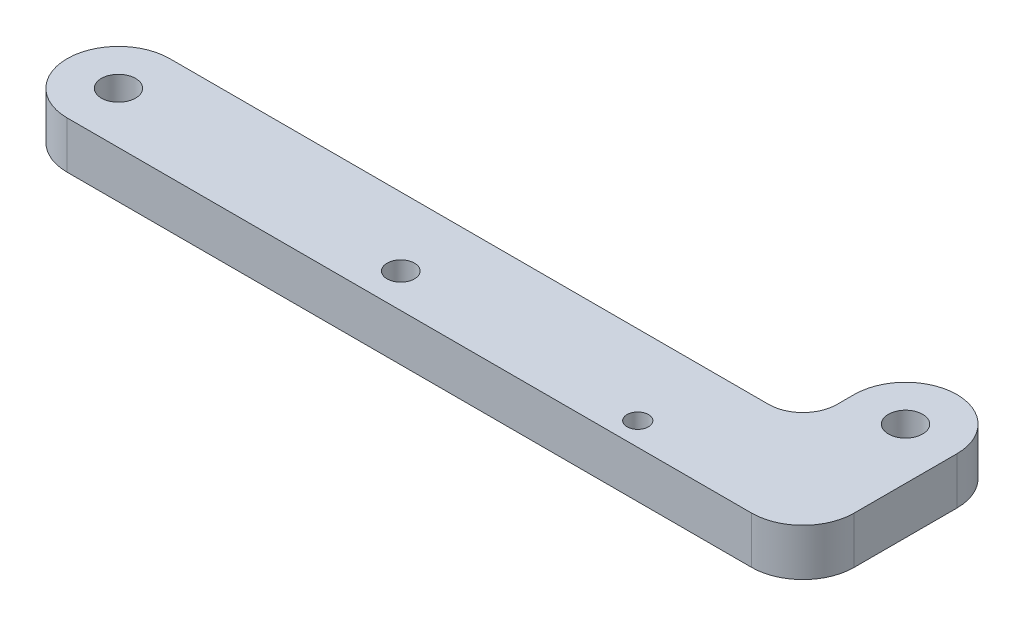
ISO-10303-21;
HEADER;
FILE_DESCRIPTION(('STEP AP214'),'2;1');
FILE_NAME('part.step','',(''),(''),'','','');
FILE_SCHEMA(('AUTOMOTIVE_DESIGN { 1 0 10303 214 1 1 1 1 }'));
ENDSEC;
DATA;
#1=APPLICATION_CONTEXT('core data for automotive mechanical design processes');
#2=APPLICATION_PROTOCOL_DEFINITION('international standard','automotive_design',2000,#1);
#3=PRODUCT_CONTEXT('',#1,'mechanical');
#4=PRODUCT('Part','Part','',(#3));
#5=PRODUCT_RELATED_PRODUCT_CATEGORY('part','',(#4));
#6=PRODUCT_DEFINITION_FORMATION('','',#4);
#7=PRODUCT_DEFINITION_CONTEXT('part definition',#1,'design');
#8=PRODUCT_DEFINITION('design','',#6,#7);
#9=PRODUCT_DEFINITION_SHAPE('','',#8);
#10=(LENGTH_UNIT() NAMED_UNIT(*) SI_UNIT(.MILLI.,.METRE.));
#11=(NAMED_UNIT(*) PLANE_ANGLE_UNIT() SI_UNIT($,.RADIAN.));
#12=(NAMED_UNIT(*) SI_UNIT($,.STERADIAN.) SOLID_ANGLE_UNIT());
#13=UNCERTAINTY_MEASURE_WITH_UNIT(LENGTH_MEASURE(1.E-05),#10,'distance_accuracy_value','');
#14=(GEOMETRIC_REPRESENTATION_CONTEXT(3) GLOBAL_UNCERTAINTY_ASSIGNED_CONTEXT((#13)) GLOBAL_UNIT_ASSIGNED_CONTEXT((#10,
#11,#12)) REPRESENTATION_CONTEXT('',''));
#15=CARTESIAN_POINT('',(0.,0.,0.));
#16=DIRECTION('',(0.,0.,1.));
#17=DIRECTION('',(1.,0.,0.));
#18=AXIS2_PLACEMENT_3D('',#15,#16,#17);
#19=CARTESIAN_POINT('',(0.,5.5,0.));
#20=DIRECTION('',(0.,1.,0.));
#21=DIRECTION('',(0.,0.,-1.));
#22=AXIS2_PLACEMENT_3D('',#19,#20,#21);
#23=PLANE('',#22);
#24=CARTESIAN_POINT('',(35.,5.5,2.));
#25=DIRECTION('',(0.,-1.,0.));
#26=DIRECTION('',(0.,0.,-1.));
#27=AXIS2_PLACEMENT_3D('',#24,#25,#26);
#28=CIRCLE('',#27,1.6);
#29=CARTESIAN_POINT('',(35.,5.5,0.400000000000002));
#30=VERTEX_POINT('',#29);
#31=EDGE_CURVE('E210',#30,#30,#28,.T.);
#32=ORIENTED_EDGE('',*,*,#31,.T.);
#33=EDGE_LOOP('',(#32));
#34=FACE_BOUND('',#33,.T.);
#35=DIRECTION('',(1.,0.,0.));
#36=VECTOR('',#35,1.);
#37=CARTESIAN_POINT('',(0.,5.5,-6.));
#38=LINE('',#37,#36);
#39=CARTESIAN_POINT('',(0.,5.5,-6.));
#40=VERTEX_POINT('',#39);
#41=CARTESIAN_POINT('',(70.,5.5,-6.));
#42=VERTEX_POINT('',#41);
#43=EDGE_CURVE('E151',#40,#42,#38,.T.);
#44=ORIENTED_EDGE('',*,*,#43,.F.);
#45=CARTESIAN_POINT('',(0.,5.5,0.));
#46=DIRECTION('',(0.,-1.,0.));
#47=DIRECTION('',(0.,0.,-1.));
#48=AXIS2_PLACEMENT_3D('',#45,#46,#47);
#49=CIRCLE('',#48,6.);
#50=CARTESIAN_POINT('',(0.,5.5,6.));
#51=VERTEX_POINT('',#50);
#52=EDGE_CURVE('E148',#51,#40,#49,.T.);
#53=ORIENTED_EDGE('',*,*,#52,.F.);
#54=DIRECTION('',(-1.,0.,0.));
#55=VECTOR('',#54,1.);
#56=CARTESIAN_POINT('',(0.,5.5,6.));
#57=LINE('',#56,#55);
#58=CARTESIAN_POINT('',(80.,5.5,6.));
#59=VERTEX_POINT('',#58);
#60=EDGE_CURVE('E158',#59,#51,#57,.T.);
#61=ORIENTED_EDGE('',*,*,#60,.F.);
#62=CARTESIAN_POINT('',(80.,5.5,0.));
#63=DIRECTION('',(0.,-1.,0.));
#64=DIRECTION('',(0.,0.,-1.));
#65=AXIS2_PLACEMENT_3D('',#62,#63,#64);
#66=CIRCLE('',#65,6.);
#67=CARTESIAN_POINT('',(86.,5.5,0.));
#68=VERTEX_POINT('',#67);
#69=EDGE_CURVE('E155',#68,#59,#66,.T.);
#70=ORIENTED_EDGE('',*,*,#69,.F.);
#71=DIRECTION('',(0.,0.,1.));
#72=VECTOR('',#71,1.);
#73=CARTESIAN_POINT('',(86.,5.5,0.));
#74=LINE('',#73,#72);
#75=CARTESIAN_POINT('',(86.,5.5,-12.));
#76=VERTEX_POINT('',#75);
#77=EDGE_CURVE('E111',#76,#68,#74,.T.);
#78=ORIENTED_EDGE('',*,*,#77,.F.);
#79=CARTESIAN_POINT('',(80.,5.5,-12.));
#80=DIRECTION('',(0.,-1.,0.));
#81=DIRECTION('',(0.,0.,-1.));
#82=AXIS2_PLACEMENT_3D('',#79,#80,#81);
#83=CIRCLE('',#82,6.00000000000002);
#84=CARTESIAN_POINT('',(74.,5.5,-12.));
#85=VERTEX_POINT('',#84);
#86=EDGE_CURVE('E105',#85,#76,#83,.T.);
#87=ORIENTED_EDGE('',*,*,#86,.F.);
#88=DIRECTION('',(0.,0.,-1.));
#89=VECTOR('',#88,1.);
#90=CARTESIAN_POINT('',(74.,5.5,0.));
#91=LINE('',#90,#89);
#92=CARTESIAN_POINT('',(74.,5.5,-10.));
#93=VERTEX_POINT('',#92);
#94=EDGE_CURVE('E114',#93,#85,#91,.T.);
#95=ORIENTED_EDGE('',*,*,#94,.F.);
#96=CARTESIAN_POINT('',(70.,5.5,-10.));
#97=DIRECTION('',(0.,-1.,0.));
#98=DIRECTION('',(0.,0.,-1.));
#99=AXIS2_PLACEMENT_3D('',#96,#97,#98);
#100=CIRCLE('',#99,4.);
#101=EDGE_CURVE('E46',#42,#93,#100,.F.);
#102=ORIENTED_EDGE('',*,*,#101,.F.);
#103=EDGE_LOOP('',(#44,#53,#61,#70,#78,#87,#95,#102));
#104=FACE_BOUND('',#103,.T.);
#105=CARTESIAN_POINT('',(0.,5.5,0.));
#106=DIRECTION('',(0.,-1.,0.));
#107=DIRECTION('',(0.,0.,-1.));
#108=AXIS2_PLACEMENT_3D('',#105,#106,#107);
#109=CIRCLE('',#108,2.);
#110=CARTESIAN_POINT('',(0.,5.5,-2.));
#111=VERTEX_POINT('',#110);
#112=EDGE_CURVE('E142',#111,#111,#109,.T.);
#113=ORIENTED_EDGE('',*,*,#112,.T.);
#114=EDGE_LOOP('',(#113));
#115=FACE_BOUND('',#114,.T.);
#116=CARTESIAN_POINT('',(64.,5.5,3.3));
#117=DIRECTION('',(0.,-1.,0.));
#118=DIRECTION('',(0.,0.,-1.));
#119=AXIS2_PLACEMENT_3D('',#116,#117,#118);
#120=CIRCLE('',#119,1.25);
#121=CARTESIAN_POINT('',(64.,5.5,2.05));
#122=VERTEX_POINT('',#121);
#123=EDGE_CURVE('E136',#122,#122,#120,.T.);
#124=ORIENTED_EDGE('',*,*,#123,.T.);
#125=EDGE_LOOP('',(#124));
#126=FACE_BOUND('',#125,.T.);
#127=CARTESIAN_POINT('',(80.,5.5,-12.));
#128=DIRECTION('',(0.,-1.,0.));
#129=DIRECTION('',(0.,0.,-1.));
#130=AXIS2_PLACEMENT_3D('',#127,#128,#129);
#131=CIRCLE('',#130,2.);
#132=CARTESIAN_POINT('',(80.,5.5,-14.));
#133=VERTEX_POINT('',#132);
#134=EDGE_CURVE('E118',#133,#133,#131,.T.);
#135=ORIENTED_EDGE('',*,*,#134,.T.);
#136=EDGE_LOOP('',(#135));
#137=FACE_BOUND('',#136,.T.);
#138=ADVANCED_FACE('F37',(#34,#104,#115,#126,#137),#23,.T.);
#139=CARTESIAN_POINT('',(0.,0.,0.));
#140=DIRECTION('',(0.,1.,0.));
#141=DIRECTION('',(0.,0.,-1.));
#142=AXIS2_PLACEMENT_3D('',#139,#140,#141);
#143=PLANE('',#142);
#144=CARTESIAN_POINT('',(35.,0.,2.));
#145=DIRECTION('',(0.,-1.,0.));
#146=DIRECTION('',(0.,0.,-1.));
#147=AXIS2_PLACEMENT_3D('',#144,#145,#146);
#148=CIRCLE('',#147,1.6);
#149=CARTESIAN_POINT('',(35.,0.,0.400000000000002));
#150=VERTEX_POINT('',#149);
#151=EDGE_CURVE('E41',#150,#150,#148,.T.);
#152=ORIENTED_EDGE('',*,*,#151,.F.);
#153=EDGE_LOOP('',(#152));
#154=FACE_BOUND('',#153,.T.);
#155=DIRECTION('',(0.,0.,1.));
#156=VECTOR('',#155,1.);
#157=CARTESIAN_POINT('',(74.,0.,0.));
#158=LINE('',#157,#156);
#159=CARTESIAN_POINT('',(74.,0.,-12.));
#160=VERTEX_POINT('',#159);
#161=CARTESIAN_POINT('',(74.,0.,-10.));
#162=VERTEX_POINT('',#161);
#163=EDGE_CURVE('E135',#160,#162,#158,.T.);
#164=ORIENTED_EDGE('',*,*,#163,.F.);
#165=CARTESIAN_POINT('',(80.,0.,-12.));
#166=DIRECTION('',(0.,-1.,0.));
#167=DIRECTION('',(0.,0.,-1.));
#168=AXIS2_PLACEMENT_3D('',#165,#166,#167);
#169=CIRCLE('',#168,6.00000000000002);
#170=CARTESIAN_POINT('',(86.,0.,-12.));
#171=VERTEX_POINT('',#170);
#172=EDGE_CURVE('E108',#171,#160,#169,.F.);
#173=ORIENTED_EDGE('',*,*,#172,.F.);
#174=DIRECTION('',(0.,0.,-1.));
#175=VECTOR('',#174,1.);
#176=CARTESIAN_POINT('',(86.,0.,0.));
#177=LINE('',#176,#175);
#178=CARTESIAN_POINT('',(86.,0.,0.));
#179=VERTEX_POINT('',#178);
#180=EDGE_CURVE('E198',#179,#171,#177,.T.);
#181=ORIENTED_EDGE('',*,*,#180,.F.);
#182=CARTESIAN_POINT('',(80.,0.,0.));
#183=DIRECTION('',(0.,-1.,0.));
#184=DIRECTION('',(0.,0.,-1.));
#185=AXIS2_PLACEMENT_3D('',#182,#183,#184);
#186=CIRCLE('',#185,6.);
#187=CARTESIAN_POINT('',(80.,0.,6.));
#188=VERTEX_POINT('',#187);
#189=EDGE_CURVE('E167',#179,#188,#186,.T.);
#190=ORIENTED_EDGE('',*,*,#189,.T.);
#191=DIRECTION('',(-1.,0.,0.));
#192=VECTOR('',#191,1.);
#193=CARTESIAN_POINT('',(0.,0.,6.));
#194=LINE('',#193,#192);
#195=CARTESIAN_POINT('',(0.,0.,6.));
#196=VERTEX_POINT('',#195);
#197=EDGE_CURVE('E152',#188,#196,#194,.T.);
#198=ORIENTED_EDGE('',*,*,#197,.T.);
#199=CARTESIAN_POINT('',(0.,0.,0.));
#200=DIRECTION('',(0.,-1.,0.));
#201=DIRECTION('',(0.,0.,-1.));
#202=AXIS2_PLACEMENT_3D('',#199,#200,#201);
#203=CIRCLE('',#202,6.);
#204=CARTESIAN_POINT('',(0.,0.,-6.));
#205=VERTEX_POINT('',#204);
#206=EDGE_CURVE('E145',#196,#205,#203,.T.);
#207=ORIENTED_EDGE('',*,*,#206,.T.);
#208=DIRECTION('',(1.,0.,0.));
#209=VECTOR('',#208,1.);
#210=CARTESIAN_POINT('',(0.,0.,-6.));
#211=LINE('',#210,#209);
#212=CARTESIAN_POINT('',(70.,0.,-6.));
#213=VERTEX_POINT('',#212);
#214=EDGE_CURVE('E164',#205,#213,#211,.T.);
#215=ORIENTED_EDGE('',*,*,#214,.T.);
#216=CARTESIAN_POINT('',(70.,0.,-10.));
#217=DIRECTION('',(0.,-1.,0.));
#218=DIRECTION('',(0.,0.,-1.));
#219=AXIS2_PLACEMENT_3D('',#216,#217,#218);
#220=CIRCLE('',#219,4.);
#221=EDGE_CURVE('E11',#162,#213,#220,.T.);
#222=ORIENTED_EDGE('',*,*,#221,.F.);
#223=EDGE_LOOP('',(#164,#173,#181,#190,#198,#207,#215,#222));
#224=FACE_BOUND('',#223,.T.);
#225=CARTESIAN_POINT('',(0.,0.,0.));
#226=DIRECTION('',(0.,-1.,0.));
#227=DIRECTION('',(0.,0.,-1.));
#228=AXIS2_PLACEMENT_3D('',#225,#226,#227);
#229=CIRCLE('',#228,2.);
#230=CARTESIAN_POINT('',(0.,0.,-2.));
#231=VERTEX_POINT('',#230);
#232=EDGE_CURVE('E139',#231,#231,#229,.T.);
#233=ORIENTED_EDGE('',*,*,#232,.F.);
#234=EDGE_LOOP('',(#233));
#235=FACE_BOUND('',#234,.T.);
#236=CARTESIAN_POINT('',(64.,0.,3.3));
#237=DIRECTION('',(0.,-1.,0.));
#238=DIRECTION('',(0.,0.,-1.));
#239=AXIS2_PLACEMENT_3D('',#236,#237,#238);
#240=CIRCLE('',#239,1.25);
#241=CARTESIAN_POINT('',(64.,0.,2.05));
#242=VERTEX_POINT('',#241);
#243=EDGE_CURVE('E134',#242,#242,#240,.T.);
#244=ORIENTED_EDGE('',*,*,#243,.F.);
#245=EDGE_LOOP('',(#244));
#246=FACE_BOUND('',#245,.T.);
#247=CARTESIAN_POINT('',(80.,0.,-12.));
#248=DIRECTION('',(0.,-1.,0.));
#249=DIRECTION('',(0.,0.,-1.));
#250=AXIS2_PLACEMENT_3D('',#247,#248,#249);
#251=CIRCLE('',#250,2.);
#252=CARTESIAN_POINT('',(80.,0.,-14.));
#253=VERTEX_POINT('',#252);
#254=EDGE_CURVE('E131',#253,#253,#251,.F.);
#255=ORIENTED_EDGE('',*,*,#254,.T.);
#256=EDGE_LOOP('',(#255));
#257=FACE_BOUND('',#256,.T.);
#258=ADVANCED_FACE('F201',(#154,#224,#235,#246,#257),#143,.F.);
#259=CARTESIAN_POINT('',(0.,5.5,0.));
#260=DIRECTION('',(0.,-1.,0.));
#261=DIRECTION('',(0.,0.,1.));
#262=AXIS2_PLACEMENT_3D('',#259,#260,#261);
#263=CYLINDRICAL_SURFACE('',#262,6.);
#264=ORIENTED_EDGE('',*,*,#206,.F.);
#265=DIRECTION('',(0.,-1.,0.));
#266=VECTOR('',#265,1.);
#267=CARTESIAN_POINT('',(0.,5.5,6.));
#268=LINE('',#267,#266);
#269=EDGE_CURVE('E161',#51,#196,#268,.T.);
#270=ORIENTED_EDGE('',*,*,#269,.F.);
#271=ORIENTED_EDGE('',*,*,#52,.T.);
#272=DIRECTION('',(0.,-1.,0.));
#273=VECTOR('',#272,1.);
#274=CARTESIAN_POINT('',(0.,5.5,-6.));
#275=LINE('',#274,#273);
#276=EDGE_CURVE('E175',#40,#205,#275,.T.);
#277=ORIENTED_EDGE('',*,*,#276,.T.);
#278=EDGE_LOOP('',(#264,#270,#271,#277));
#279=FACE_BOUND('',#278,.T.);
#280=ADVANCED_FACE('F186',(#279),#263,.T.);
#281=CARTESIAN_POINT('',(0.,5.5,-6.));
#282=DIRECTION('',(0.,0.,1.));
#283=DIRECTION('',(-1.,0.,0.));
#284=AXIS2_PLACEMENT_3D('',#281,#282,#283);
#285=PLANE('',#284);
#286=ORIENTED_EDGE('',*,*,#214,.F.);
#287=ORIENTED_EDGE('',*,*,#276,.F.);
#288=ORIENTED_EDGE('',*,*,#43,.T.);
#289=DIRECTION('',(0.,1.,0.));
#290=VECTOR('',#289,1.);
#291=CARTESIAN_POINT('',(70.,5.5,-6.));
#292=LINE('',#291,#290);
#293=EDGE_CURVE('E177',#213,#42,#292,.T.);
#294=ORIENTED_EDGE('',*,*,#293,.F.);
#295=EDGE_LOOP('',(#286,#287,#288,#294));
#296=FACE_BOUND('',#295,.T.);
#297=ADVANCED_FACE('F183',(#296),#285,.F.);
#298=CARTESIAN_POINT('',(80.,5.5,0.));
#299=DIRECTION('',(0.,-1.,0.));
#300=DIRECTION('',(0.,0.,1.));
#301=AXIS2_PLACEMENT_3D('',#298,#299,#300);
#302=CYLINDRICAL_SURFACE('',#301,6.);
#303=ORIENTED_EDGE('',*,*,#69,.T.);
#304=DIRECTION('',(0.,-1.,0.));
#305=VECTOR('',#304,1.);
#306=CARTESIAN_POINT('',(80.,5.5,6.));
#307=LINE('',#306,#305);
#308=EDGE_CURVE('E173',#59,#188,#307,.T.);
#309=ORIENTED_EDGE('',*,*,#308,.T.);
#310=ORIENTED_EDGE('',*,*,#189,.F.);
#311=DIRECTION('',(0.,1.,0.));
#312=VECTOR('',#311,1.);
#313=CARTESIAN_POINT('',(86.,-26.8328157299975,0.));
#314=LINE('',#313,#312);
#315=EDGE_CURVE('E128',#179,#68,#314,.T.);
#316=ORIENTED_EDGE('',*,*,#315,.T.);
#317=EDGE_LOOP('',(#303,#309,#310,#316));
#318=FACE_BOUND('',#317,.T.);
#319=ADVANCED_FACE('F193',(#318),#302,.T.);
#320=CARTESIAN_POINT('',(0.,5.5,6.));
#321=DIRECTION('',(0.,0.,-1.));
#322=DIRECTION('',(1.,0.,0.));
#323=AXIS2_PLACEMENT_3D('',#320,#321,#322);
#324=PLANE('',#323);
#325=ORIENTED_EDGE('',*,*,#197,.F.);
#326=ORIENTED_EDGE('',*,*,#308,.F.);
#327=ORIENTED_EDGE('',*,*,#60,.T.);
#328=ORIENTED_EDGE('',*,*,#269,.T.);
#329=EDGE_LOOP('',(#325,#326,#327,#328));
#330=FACE_BOUND('',#329,.T.);
#331=ADVANCED_FACE('F190',(#330),#324,.F.);
#332=CARTESIAN_POINT('',(0.,5.5,0.));
#333=DIRECTION('',(0.,-1.,0.));
#334=DIRECTION('',(0.,0.,1.));
#335=AXIS2_PLACEMENT_3D('',#332,#333,#334);
#336=CYLINDRICAL_SURFACE('',#335,2.);
#337=ORIENTED_EDGE('',*,*,#112,.F.);
#338=EDGE_LOOP('',(#337));
#339=FACE_BOUND('',#338,.T.);
#340=ORIENTED_EDGE('',*,*,#232,.T.);
#341=EDGE_LOOP('',(#340));
#342=FACE_BOUND('',#341,.T.);
#343=ADVANCED_FACE('F233',(#339,#342),#336,.F.);
#344=CARTESIAN_POINT('',(64.,5.5,3.3));
#345=DIRECTION('',(0.,-1.,0.));
#346=DIRECTION('',(0.,0.,1.));
#347=AXIS2_PLACEMENT_3D('',#344,#345,#346);
#348=CYLINDRICAL_SURFACE('',#347,1.25);
#349=ORIENTED_EDGE('',*,*,#123,.F.);
#350=EDGE_LOOP('',(#349));
#351=FACE_BOUND('',#350,.T.);
#352=ORIENTED_EDGE('',*,*,#243,.T.);
#353=EDGE_LOOP('',(#352));
#354=FACE_BOUND('',#353,.T.);
#355=ADVANCED_FACE('F264',(#351,#354),#348,.F.);
#356=CARTESIAN_POINT('',(74.,-26.8328157299975,0.));
#357=DIRECTION('',(-1.,0.,0.));
#358=DIRECTION('',(0.,0.,-1.));
#359=AXIS2_PLACEMENT_3D('',#356,#357,#358);
#360=PLANE('',#359);
#361=ORIENTED_EDGE('',*,*,#94,.T.);
#362=DIRECTION('',(0.,1.,0.));
#363=VECTOR('',#362,1.);
#364=CARTESIAN_POINT('',(74.,-26.8328157299975,-12.));
#365=LINE('',#364,#363);
#366=EDGE_CURVE('E102',#160,#85,#365,.T.);
#367=ORIENTED_EDGE('',*,*,#366,.F.);
#368=ORIENTED_EDGE('',*,*,#163,.T.);
#369=DIRECTION('',(0.,1.,0.));
#370=VECTOR('',#369,1.);
#371=CARTESIAN_POINT('',(74.,-26.8328157299975,-10.));
#372=LINE('',#371,#370);
#373=EDGE_CURVE('E53',#93,#162,#372,.F.);
#374=ORIENTED_EDGE('',*,*,#373,.F.);
#375=EDGE_LOOP('',(#361,#367,#368,#374));
#376=FACE_BOUND('',#375,.T.);
#377=ADVANCED_FACE('F115',(#376),#360,.T.);
#378=CARTESIAN_POINT('',(80.,-26.8328157299975,-12.));
#379=DIRECTION('',(0.,1.,0.));
#380=DIRECTION('',(0.,0.,-1.));
#381=AXIS2_PLACEMENT_3D('',#378,#379,#380);
#382=CYLINDRICAL_SURFACE('',#381,6.00000000000002);
#383=ORIENTED_EDGE('',*,*,#172,.T.);
#384=ORIENTED_EDGE('',*,*,#366,.T.);
#385=ORIENTED_EDGE('',*,*,#86,.T.);
#386=DIRECTION('',(0.,1.,0.));
#387=VECTOR('',#386,1.);
#388=CARTESIAN_POINT('',(86.,-26.8328157299975,-12.));
#389=LINE('',#388,#387);
#390=EDGE_CURVE('E110',#171,#76,#389,.T.);
#391=ORIENTED_EDGE('',*,*,#390,.F.);
#392=EDGE_LOOP('',(#383,#384,#385,#391));
#393=FACE_BOUND('',#392,.T.);
#394=ADVANCED_FACE('F103',(#393),#382,.T.);
#395=CARTESIAN_POINT('',(86.,-26.8328157299975,0.));
#396=DIRECTION('',(1.,0.,0.));
#397=DIRECTION('',(0.,0.,1.));
#398=AXIS2_PLACEMENT_3D('',#395,#396,#397);
#399=PLANE('',#398);
#400=ORIENTED_EDGE('',*,*,#180,.T.);
#401=ORIENTED_EDGE('',*,*,#390,.T.);
#402=ORIENTED_EDGE('',*,*,#77,.T.);
#403=ORIENTED_EDGE('',*,*,#315,.F.);
#404=EDGE_LOOP('',(#400,#401,#402,#403));
#405=FACE_BOUND('',#404,.T.);
#406=ADVANCED_FACE('F197',(#405),#399,.T.);
#407=CARTESIAN_POINT('',(80.,-26.8328157299975,-12.));
#408=DIRECTION('',(0.,1.,0.));
#409=DIRECTION('',(0.,0.,-1.));
#410=AXIS2_PLACEMENT_3D('',#407,#408,#409);
#411=CYLINDRICAL_SURFACE('',#410,2.);
#412=ORIENTED_EDGE('',*,*,#254,.F.);
#413=EDGE_LOOP('',(#412));
#414=FACE_BOUND('',#413,.T.);
#415=ORIENTED_EDGE('',*,*,#134,.F.);
#416=EDGE_LOOP('',(#415));
#417=FACE_BOUND('',#416,.T.);
#418=ADVANCED_FACE('F223',(#414,#417),#411,.F.);
#419=CARTESIAN_POINT('',(70.,5.5,-10.));
#420=DIRECTION('',(0.,1.,0.));
#421=DIRECTION('',(0.,0.,-1.));
#422=AXIS2_PLACEMENT_3D('',#419,#420,#421);
#423=CYLINDRICAL_SURFACE('',#422,4.);
#424=ORIENTED_EDGE('',*,*,#221,.T.);
#425=ORIENTED_EDGE('',*,*,#293,.T.);
#426=ORIENTED_EDGE('',*,*,#101,.T.);
#427=ORIENTED_EDGE('',*,*,#373,.T.);
#428=EDGE_LOOP('',(#424,#425,#426,#427));
#429=FACE_BOUND('',#428,.T.);
#430=ADVANCED_FACE('F39',(#429),#423,.F.);
#431=CARTESIAN_POINT('',(35.,-4.5,2.));
#432=DIRECTION('',(0.,1.,0.));
#433=DIRECTION('',(0.,0.,-1.));
#434=AXIS2_PLACEMENT_3D('',#431,#432,#433);
#435=CYLINDRICAL_SURFACE('',#434,1.6);
#436=ORIENTED_EDGE('',*,*,#31,.F.);
#437=EDGE_LOOP('',(#436));
#438=FACE_BOUND('',#437,.T.);
#439=ORIENTED_EDGE('',*,*,#151,.T.);
#440=EDGE_LOOP('',(#439));
#441=FACE_BOUND('',#440,.T.);
#442=ADVANCED_FACE('F217',(#438,#441),#435,.F.);
#443=CLOSED_SHELL('',(#138,#258,#280,#297,#319,#331,#343,#355,#377,#394,#406,#418,#430,#442));
#444=MANIFOLD_SOLID_BREP('B2',#443);
#445=ADVANCED_BREP_SHAPE_REPRESENTATION('',(#18,#444),#14);
#446=SHAPE_DEFINITION_REPRESENTATION(#9,#445);
ENDSEC;
END-ISO-10303-21;
